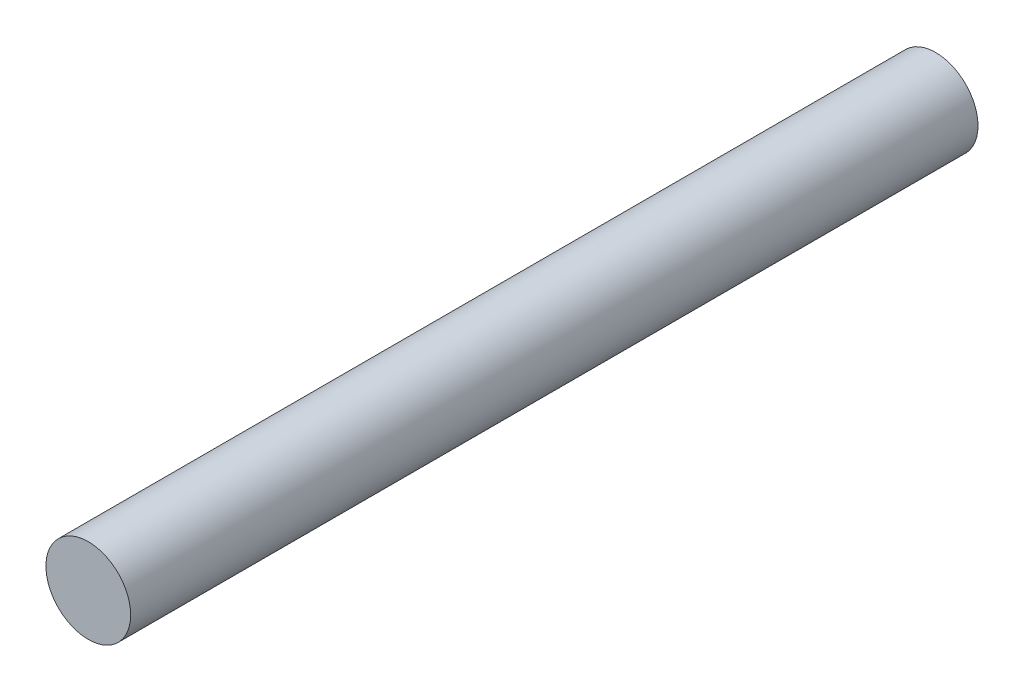
ISO-10303-21;
HEADER;
FILE_DESCRIPTION(('STEP AP214'),'2;1');
FILE_NAME('part.step','',(''),(''),'','','');
FILE_SCHEMA(('AUTOMOTIVE_DESIGN { 1 0 10303 214 1 1 1 1 }'));
ENDSEC;
DATA;
#1=APPLICATION_CONTEXT('core data for automotive mechanical design processes');
#2=APPLICATION_PROTOCOL_DEFINITION('international standard','automotive_design',2000,#1);
#3=PRODUCT_CONTEXT('',#1,'mechanical');
#4=PRODUCT('Part','Part','',(#3));
#5=PRODUCT_RELATED_PRODUCT_CATEGORY('part','',(#4));
#6=PRODUCT_DEFINITION_FORMATION('','',#4);
#7=PRODUCT_DEFINITION_CONTEXT('part definition',#1,'design');
#8=PRODUCT_DEFINITION('design','',#6,#7);
#9=PRODUCT_DEFINITION_SHAPE('','',#8);
#10=(LENGTH_UNIT() NAMED_UNIT(*) SI_UNIT(.MILLI.,.METRE.));
#11=(NAMED_UNIT(*) PLANE_ANGLE_UNIT() SI_UNIT($,.RADIAN.));
#12=(NAMED_UNIT(*) SI_UNIT($,.STERADIAN.) SOLID_ANGLE_UNIT());
#13=UNCERTAINTY_MEASURE_WITH_UNIT(LENGTH_MEASURE(1.E-05),#10,'distance_accuracy_value','');
#14=(GEOMETRIC_REPRESENTATION_CONTEXT(3) GLOBAL_UNCERTAINTY_ASSIGNED_CONTEXT((#13)) GLOBAL_UNIT_ASSIGNED_CONTEXT((#10,
#11,#12)) REPRESENTATION_CONTEXT('',''));
#15=CARTESIAN_POINT('',(0.,0.,0.));
#16=DIRECTION('',(0.,0.,1.));
#17=DIRECTION('',(1.,0.,0.));
#18=AXIS2_PLACEMENT_3D('',#15,#16,#17);
#19=CARTESIAN_POINT('',(0.,0.,10.));
#20=DIRECTION('',(0.,0.,-1.));
#21=DIRECTION('',(-1.,0.,0.));
#22=AXIS2_PLACEMENT_3D('',#19,#20,#21);
#23=CYLINDRICAL_SURFACE('',#22,1.);
#24=CARTESIAN_POINT('',(0.,0.,10.));
#25=DIRECTION('',(0.,0.,1.));
#26=DIRECTION('',(1.,0.,0.));
#27=AXIS2_PLACEMENT_3D('',#24,#25,#26);
#28=CIRCLE('',#27,1.);
#29=CARTESIAN_POINT('',(1.,0.,10.));
#30=VERTEX_POINT('',#29);
#31=EDGE_CURVE('E10',#30,#30,#28,.T.);
#32=ORIENTED_EDGE('',*,*,#31,.F.);
#33=EDGE_LOOP('',(#32));
#34=FACE_BOUND('',#33,.T.);
#35=CARTESIAN_POINT('',(0.,0.,-10.));
#36=DIRECTION('',(0.,0.,1.));
#37=DIRECTION('',(1.,0.,0.));
#38=AXIS2_PLACEMENT_3D('',#35,#36,#37);
#39=CIRCLE('',#38,1.);
#40=CARTESIAN_POINT('',(1.,0.,-10.));
#41=VERTEX_POINT('',#40);
#42=EDGE_CURVE('E42',#41,#41,#39,.T.);
#43=ORIENTED_EDGE('',*,*,#42,.T.);
#44=EDGE_LOOP('',(#43));
#45=FACE_BOUND('',#44,.T.);
#46=ADVANCED_FACE('F39',(#34,#45),#23,.T.);
#47=CARTESIAN_POINT('',(0.,0.,10.));
#48=DIRECTION('',(0.,0.,1.));
#49=DIRECTION('',(1.,0.,0.));
#50=AXIS2_PLACEMENT_3D('',#47,#48,#49);
#51=PLANE('',#50);
#52=ORIENTED_EDGE('',*,*,#31,.T.);
#53=EDGE_LOOP('',(#52));
#54=FACE_BOUND('',#53,.T.);
#55=ADVANCED_FACE('F54',(#54),#51,.T.);
#56=CARTESIAN_POINT('',(0.,0.,-10.));
#57=DIRECTION('',(0.,0.,1.));
#58=DIRECTION('',(1.,0.,0.));
#59=AXIS2_PLACEMENT_3D('',#56,#57,#58);
#60=PLANE('',#59);
#61=ORIENTED_EDGE('',*,*,#42,.F.);
#62=EDGE_LOOP('',(#61));
#63=FACE_BOUND('',#62,.T.);
#64=ADVANCED_FACE('F52',(#63),#60,.F.);
#65=CLOSED_SHELL('',(#46,#55,#64));
#66=MANIFOLD_SOLID_BREP('B2',#65);
#67=ADVANCED_BREP_SHAPE_REPRESENTATION('',(#18,#66),#14);
#68=SHAPE_DEFINITION_REPRESENTATION(#9,#67);
ENDSEC;
END-ISO-10303-21;
